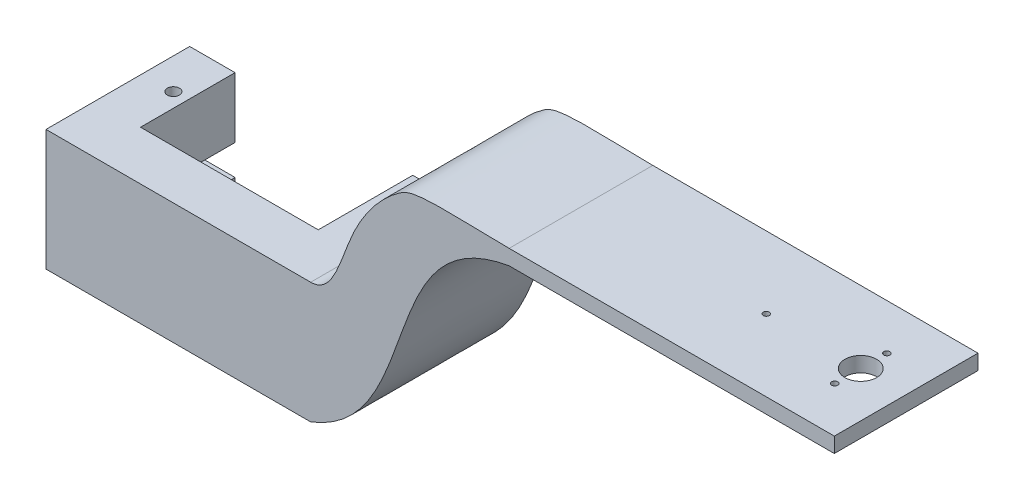
ISO-10303-21;
HEADER;
FILE_DESCRIPTION(('STEP AP214'),'2;1');
FILE_NAME('part.step','',(''),(''),'','','');
FILE_SCHEMA(('AUTOMOTIVE_DESIGN { 1 0 10303 214 1 1 1 1 }'));
ENDSEC;
DATA;
#1=APPLICATION_CONTEXT('core data for automotive mechanical design processes');
#2=APPLICATION_PROTOCOL_DEFINITION('international standard','automotive_design',2000,#1);
#3=PRODUCT_CONTEXT('',#1,'mechanical');
#4=PRODUCT('Part','Part','',(#3));
#5=PRODUCT_RELATED_PRODUCT_CATEGORY('part','',(#4));
#6=PRODUCT_DEFINITION_FORMATION('','',#4);
#7=PRODUCT_DEFINITION_CONTEXT('part definition',#1,'design');
#8=PRODUCT_DEFINITION('design','',#6,#7);
#9=PRODUCT_DEFINITION_SHAPE('','',#8);
#10=(LENGTH_UNIT() NAMED_UNIT(*) SI_UNIT(.MILLI.,.METRE.));
#11=(NAMED_UNIT(*) PLANE_ANGLE_UNIT() SI_UNIT($,.RADIAN.));
#12=(NAMED_UNIT(*) SI_UNIT($,.STERADIAN.) SOLID_ANGLE_UNIT());
#13=UNCERTAINTY_MEASURE_WITH_UNIT(LENGTH_MEASURE(1.E-05),#10,'distance_accuracy_value','');
#14=(GEOMETRIC_REPRESENTATION_CONTEXT(3) GLOBAL_UNCERTAINTY_ASSIGNED_CONTEXT((#13)) GLOBAL_UNIT_ASSIGNED_CONTEXT((#10,
#11,#12)) REPRESENTATION_CONTEXT('',''));
#15=CARTESIAN_POINT('',(0.,0.,0.));
#16=DIRECTION('',(0.,0.,1.));
#17=DIRECTION('',(1.,0.,0.));
#18=AXIS2_PLACEMENT_3D('',#15,#16,#17);
#19=CARTESIAN_POINT('',(-9.99999999999999,2.,-9.50000000000001));
#20=DIRECTION('',(0.,0.,1.));
#21=DIRECTION('',(1.,0.,0.));
#22=AXIS2_PLACEMENT_3D('',#19,#20,#21);
#23=PLANE('',#22);
#24=DIRECTION('',(1.,0.,0.));
#25=VECTOR('',#24,1.);
#26=CARTESIAN_POINT('',(-9.99999999999999,-6.,-9.50000000000001));
#27=LINE('',#26,#25);
#28=CARTESIAN_POINT('',(-45.,-6.,-9.5));
#29=VERTEX_POINT('',#28);
#30=CARTESIAN_POINT('',(-39.,-6.,-9.5));
#31=VERTEX_POINT('',#30);
#32=EDGE_CURVE('E333',#29,#31,#27,.T.);
#33=ORIENTED_EDGE('',*,*,#32,.F.);
#34=DIRECTION('',(0.,-1.,0.));
#35=VECTOR('',#34,1.);
#36=CARTESIAN_POINT('',(-45.,2.,-9.5));
#37=LINE('',#36,#35);
#38=CARTESIAN_POINT('',(-45.,2.,-9.5));
#39=VERTEX_POINT('',#38);
#40=EDGE_CURVE('E336',#39,#29,#37,.T.);
#41=ORIENTED_EDGE('',*,*,#40,.F.);
#42=DIRECTION('',(-1.,0.,0.));
#43=VECTOR('',#42,1.);
#44=CARTESIAN_POINT('',(-9.99999999999999,2.,-9.50000000000001));
#45=LINE('',#44,#43);
#46=CARTESIAN_POINT('',(-39.,2.,-9.5));
#47=VERTEX_POINT('',#46);
#48=EDGE_CURVE('E470',#47,#39,#45,.T.);
#49=ORIENTED_EDGE('',*,*,#48,.F.);
#50=DIRECTION('',(0.,1.,0.));
#51=VECTOR('',#50,1.);
#52=CARTESIAN_POINT('',(-39.,-14.,-9.5));
#53=LINE('',#52,#51);
#54=EDGE_CURVE('E338',#31,#47,#53,.T.);
#55=ORIENTED_EDGE('',*,*,#54,.F.);
#56=EDGE_LOOP('',(#33,#41,#49,#55));
#57=FACE_BOUND('',#56,.T.);
#58=ADVANCED_FACE('F41',(#57),#23,.F.);
#59=DIRECTION('',(-1.,0.,0.));
#60=VECTOR('',#59,1.);
#61=CARTESIAN_POINT('',(-9.99999999999999,-10.,-9.50000000000001));
#62=LINE('',#61,#60);
#63=CARTESIAN_POINT('',(-39.,-10.,-9.5));
#64=VERTEX_POINT('',#63);
#65=CARTESIAN_POINT('',(-45.,-10.,-9.5));
#66=VERTEX_POINT('',#65);
#67=EDGE_CURVE('E535',#64,#66,#62,.T.);
#68=ORIENTED_EDGE('',*,*,#67,.F.);
#69=CARTESIAN_POINT('',(-39.,-14.,-9.5));
#70=VERTEX_POINT('',#69);
#71=EDGE_CURVE('E498',#70,#64,#53,.T.);
#72=ORIENTED_EDGE('',*,*,#71,.F.);
#73=DIRECTION('',(1.,0.,0.));
#74=VECTOR('',#73,1.);
#75=CARTESIAN_POINT('',(-45.,-14.,-9.50000000000001));
#76=LINE('',#75,#74);
#77=CARTESIAN_POINT('',(-45.,-14.,-9.50000000000001));
#78=VERTEX_POINT('',#77);
#79=EDGE_CURVE('E452',#78,#70,#76,.T.);
#80=ORIENTED_EDGE('',*,*,#79,.F.);
#81=EDGE_CURVE('E352',#66,#78,#37,.T.);
#82=ORIENTED_EDGE('',*,*,#81,.F.);
#83=EDGE_LOOP('',(#68,#72,#80,#82));
#84=FACE_BOUND('',#83,.T.);
#85=ADVANCED_FACE('F300',(#84),#23,.F.);
#86=CARTESIAN_POINT('',(-45.,2.,9.5));
#87=DIRECTION('',(1.,0.,0.));
#88=DIRECTION('',(0.,0.,-1.));
#89=AXIS2_PLACEMENT_3D('',#86,#87,#88);
#90=PLANE('',#89);
#91=DIRECTION('',(0.,0.,-1.));
#92=VECTOR('',#91,1.);
#93=CARTESIAN_POINT('',(-45.,-6.,9.5));
#94=LINE('',#93,#92);
#95=CARTESIAN_POINT('',(-45.,-6.,1.27644844882707));
#96=VERTEX_POINT('',#95);
#97=EDGE_CURVE('E342',#96,#29,#94,.T.);
#98=ORIENTED_EDGE('',*,*,#97,.F.);
#99=DIRECTION('',(0.,1.,0.));
#100=VECTOR('',#99,1.);
#101=CARTESIAN_POINT('',(-45.,2.,1.27644844882707));
#102=LINE('',#101,#100);
#103=CARTESIAN_POINT('',(-45.,-10.,1.27644844882707));
#104=VERTEX_POINT('',#103);
#105=EDGE_CURVE('E519',#104,#96,#102,.T.);
#106=ORIENTED_EDGE('',*,*,#105,.F.);
#107=DIRECTION('',(0.,0.,1.));
#108=VECTOR('',#107,1.);
#109=CARTESIAN_POINT('',(-45.,-10.,9.5));
#110=LINE('',#109,#108);
#111=EDGE_CURVE('E532',#66,#104,#110,.T.);
#112=ORIENTED_EDGE('',*,*,#111,.F.);
#113=ORIENTED_EDGE('',*,*,#81,.T.);
#114=DIRECTION('',(0.,0.,-1.));
#115=VECTOR('',#114,1.);
#116=CARTESIAN_POINT('',(-45.,-14.,9.5));
#117=LINE('',#116,#115);
#118=CARTESIAN_POINT('',(-45.,-14.,9.5));
#119=VERTEX_POINT('',#118);
#120=EDGE_CURVE('E501',#119,#78,#117,.T.);
#121=ORIENTED_EDGE('',*,*,#120,.F.);
#122=DIRECTION('',(0.,-1.,0.));
#123=VECTOR('',#122,1.);
#124=CARTESIAN_POINT('',(-45.,2.,9.5));
#125=LINE('',#124,#123);
#126=CARTESIAN_POINT('',(-45.,2.,9.5));
#127=VERTEX_POINT('',#126);
#128=EDGE_CURVE('E351',#127,#119,#125,.T.);
#129=ORIENTED_EDGE('',*,*,#128,.F.);
#130=DIRECTION('',(0.,0.,1.));
#131=VECTOR('',#130,1.);
#132=CARTESIAN_POINT('',(-45.,2.,9.5));
#133=LINE('',#132,#131);
#134=EDGE_CURVE('E349',#39,#127,#133,.T.);
#135=ORIENTED_EDGE('',*,*,#134,.F.);
#136=ORIENTED_EDGE('',*,*,#40,.T.);
#137=EDGE_LOOP('',(#98,#106,#112,#113,#121,#129,#135,#136));
#138=FACE_BOUND('',#137,.T.);
#139=ADVANCED_FACE('F289',(#138),#90,.F.);
#140=CARTESIAN_POINT('',(-39.,-14.,3.));
#141=DIRECTION('',(-1.,0.,0.));
#142=DIRECTION('',(0.,0.,1.));
#143=AXIS2_PLACEMENT_3D('',#140,#141,#142);
#144=PLANE('',#143);
#145=DIRECTION('',(0.,0.,1.));
#146=VECTOR('',#145,1.);
#147=CARTESIAN_POINT('',(-39.,-6.,3.));
#148=LINE('',#147,#146);
#149=CARTESIAN_POINT('',(-39.,-6.,1.27644844882707));
#150=VERTEX_POINT('',#149);
#151=EDGE_CURVE('E343',#31,#150,#148,.T.);
#152=ORIENTED_EDGE('',*,*,#151,.F.);
#153=ORIENTED_EDGE('',*,*,#54,.T.);
#154=DIRECTION('',(0.,0.,1.));
#155=VECTOR('',#154,1.);
#156=CARTESIAN_POINT('',(-39.,2.,3.));
#157=LINE('',#156,#155);
#158=CARTESIAN_POINT('',(-39.,2.,3.));
#159=VERTEX_POINT('',#158);
#160=EDGE_CURVE('E494',#47,#159,#157,.T.);
#161=ORIENTED_EDGE('',*,*,#160,.T.);
#162=DIRECTION('',(0.,1.,0.));
#163=VECTOR('',#162,1.);
#164=CARTESIAN_POINT('',(-39.,-14.,3.));
#165=LINE('',#164,#163);
#166=CARTESIAN_POINT('',(-39.,-14.,3.));
#167=VERTEX_POINT('',#166);
#168=EDGE_CURVE('E505',#167,#159,#165,.T.);
#169=ORIENTED_EDGE('',*,*,#168,.F.);
#170=DIRECTION('',(0.,0.,1.));
#171=VECTOR('',#170,1.);
#172=CARTESIAN_POINT('',(-39.,-14.,3.));
#173=LINE('',#172,#171);
#174=EDGE_CURVE('E486',#70,#167,#173,.T.);
#175=ORIENTED_EDGE('',*,*,#174,.F.);
#176=ORIENTED_EDGE('',*,*,#71,.T.);
#177=DIRECTION('',(0.,0.,-1.));
#178=VECTOR('',#177,1.);
#179=CARTESIAN_POINT('',(-39.,-10.,3.));
#180=LINE('',#179,#178);
#181=CARTESIAN_POINT('',(-39.,-10.,1.27644844882707));
#182=VERTEX_POINT('',#181);
#183=EDGE_CURVE('E538',#182,#64,#180,.T.);
#184=ORIENTED_EDGE('',*,*,#183,.F.);
#185=DIRECTION('',(0.,-1.,0.));
#186=VECTOR('',#185,1.);
#187=CARTESIAN_POINT('',(-39.,-14.,1.27644844882707));
#188=LINE('',#187,#186);
#189=EDGE_CURVE('E521',#150,#182,#188,.T.);
#190=ORIENTED_EDGE('',*,*,#189,.F.);
#191=EDGE_LOOP('',(#152,#153,#161,#169,#175,#176,#184,#190));
#192=FACE_BOUND('',#191,.T.);
#193=ADVANCED_FACE('F285',(#192),#144,.F.);
#194=CARTESIAN_POINT('',(-9.99999999999999,2.,9.5));
#195=DIRECTION('',(0.,0.,-1.));
#196=DIRECTION('',(-1.,0.,0.));
#197=AXIS2_PLACEMENT_3D('',#194,#195,#196);
#198=PLANE('',#197);
#199=ORIENTED_EDGE('',*,*,#128,.T.);
#200=DIRECTION('',(-1.,0.,0.));
#201=VECTOR('',#200,1.);
#202=CARTESIAN_POINT('',(-45.,-14.,9.5));
#203=LINE('',#202,#201);
#204=CARTESIAN_POINT('',(-9.99999999999999,-14.,9.5));
#205=VERTEX_POINT('',#204);
#206=EDGE_CURVE('E451',#205,#119,#203,.T.);
#207=ORIENTED_EDGE('',*,*,#206,.F.);
#208=CARTESIAN_POINT('',(-9.99999999999999,-14.,9.5));
#209=CARTESIAN_POINT('',(5.21569135394911,-8.08288129869125,9.5));
#210=CARTESIAN_POINT('',(-1.57165890281514,13.9676971465737,9.5));
#211=CARTESIAN_POINT('',(16.2442553747671,17.,9.5));
#212=B_SPLINE_CURVE_WITH_KNOTS('',3,(#208,#209,#210,#211),.UNSPECIFIED.,.F.,.F.,(4,4),(0.,1.),.UNSPECIFIED.);
#213=CARTESIAN_POINT('',(16.2442553747671,17.,9.5));
#214=VERTEX_POINT('',#213);
#215=EDGE_CURVE('E169',#205,#214,#212,.T.);
#216=ORIENTED_EDGE('',*,*,#215,.T.);
#217=DIRECTION('',(-1.,0.,0.));
#218=VECTOR('',#217,1.);
#219=CARTESIAN_POINT('',(56.2442553747671,17.,9.5));
#220=LINE('',#219,#218);
#221=CARTESIAN_POINT('',(59.2442553747671,17.,9.5));
#222=VERTEX_POINT('',#221);
#223=EDGE_CURVE('E238',#222,#214,#220,.T.);
#224=ORIENTED_EDGE('',*,*,#223,.F.);
#225=DIRECTION('',(0.,-1.,0.));
#226=VECTOR('',#225,1.);
#227=CARTESIAN_POINT('',(59.2442553747671,19.,9.5));
#228=LINE('',#227,#226);
#229=CARTESIAN_POINT('',(59.2442553747671,19.,9.5));
#230=VERTEX_POINT('',#229);
#231=EDGE_CURVE('E180',#230,#222,#228,.T.);
#232=ORIENTED_EDGE('',*,*,#231,.F.);
#233=DIRECTION('',(-1.,0.,0.));
#234=VECTOR('',#233,1.);
#235=CARTESIAN_POINT('',(56.2442553747671,19.,9.5));
#236=LINE('',#235,#234);
#237=CARTESIAN_POINT('',(16.2442553747671,19.,9.5));
#238=VERTEX_POINT('',#237);
#239=EDGE_CURVE('E170',#230,#238,#236,.T.);
#240=ORIENTED_EDGE('',*,*,#239,.T.);
#241=CARTESIAN_POINT('',(16.2442553747671,19.,9.5));
#242=CARTESIAN_POINT('',(11.2126075886344,19.,9.5));
#243=CARTESIAN_POINT('',(4.06646906797156,19.553217376439,9.5));
#244=CARTESIAN_POINT('',(-0.106803103522299,16.9833287421813,9.5));
#245=CARTESIAN_POINT('',(-5.24229462163909,11.0378133686641,9.5));
#246=CARTESIAN_POINT('',(-6.97775803900934,1.99999999999998,9.5));
#247=CARTESIAN_POINT('',(-9.99999999999999,2.,9.5));
#248=B_SPLINE_CURVE_WITH_KNOTS('',3,(#241,#242,#243,#244,#245,#246,#247),.UNSPECIFIED.,.F.,.F.,
(4,1,1,1,4),(0.,0.246137696342118,0.311425048470264,0.652873521281456,1.),.UNSPECIFIED.);
#249=CARTESIAN_POINT('',(-9.99999999999999,2.,9.5));
#250=VERTEX_POINT('',#249);
#251=EDGE_CURVE('E250',#238,#250,#248,.T.);
#252=ORIENTED_EDGE('',*,*,#251,.T.);
#253=DIRECTION('',(1.,0.,0.));
#254=VECTOR('',#253,1.);
#255=CARTESIAN_POINT('',(-9.99999999999999,2.,9.5));
#256=LINE('',#255,#254);
#257=EDGE_CURVE('E464',#127,#250,#256,.T.);
#258=ORIENTED_EDGE('',*,*,#257,.F.);
#259=EDGE_LOOP('',(#199,#207,#216,#224,#232,#240,#252,#258));
#260=FACE_BOUND('',#259,.T.);
#261=ADVANCED_FACE('F288',(#260),#198,.F.);
#262=CARTESIAN_POINT('',(-15.5,-14.,-9.50000000000001));
#263=VERTEX_POINT('',#262);
#264=CARTESIAN_POINT('',(-9.99999999999999,-14.,-9.5));
#265=VERTEX_POINT('',#264);
#266=EDGE_CURVE('E458',#263,#265,#76,.T.);
#267=ORIENTED_EDGE('',*,*,#266,.F.);
#268=DIRECTION('',(0.,1.,0.));
#269=VECTOR('',#268,1.);
#270=CARTESIAN_POINT('',(-15.5,-14.,-9.50000000000001));
#271=LINE('',#270,#269);
#272=CARTESIAN_POINT('',(-15.5,2.,-9.50000000000001));
#273=VERTEX_POINT('',#272);
#274=EDGE_CURVE('E480',#263,#273,#271,.T.);
#275=ORIENTED_EDGE('',*,*,#274,.T.);
#276=CARTESIAN_POINT('',(-9.99999999999999,2.,-9.5));
#277=VERTEX_POINT('',#276);
#278=EDGE_CURVE('E358',#277,#273,#45,.T.);
#279=ORIENTED_EDGE('',*,*,#278,.F.);
#280=CARTESIAN_POINT('',(16.2442553747671,19.,-9.5));
#281=CARTESIAN_POINT('',(11.2126075886344,19.,-9.5));
#282=CARTESIAN_POINT('',(4.06646906797156,19.553217376439,-9.5));
#283=CARTESIAN_POINT('',(-0.106803103522299,16.9833287421813,-9.5));
#284=CARTESIAN_POINT('',(-5.24229462163909,11.0378133686641,-9.5));
#285=CARTESIAN_POINT('',(-6.97775803900934,1.99999999999998,-9.5));
#286=CARTESIAN_POINT('',(-9.99999999999999,2.,-9.5));
#287=B_SPLINE_CURVE_WITH_KNOTS('',3,(#280,#281,#282,#283,#284,#285,#286),.UNSPECIFIED.,.F.,.F.,
(4,1,1,1,4),(0.,0.246137696342118,0.311425048470264,0.652873521281456,1.),.UNSPECIFIED.);
#288=CARTESIAN_POINT('',(16.2442553747671,19.,-9.5));
#289=VERTEX_POINT('',#288);
#290=EDGE_CURVE('E165',#289,#277,#287,.T.);
#291=ORIENTED_EDGE('',*,*,#290,.F.);
#292=DIRECTION('',(-1.,0.,0.));
#293=VECTOR('',#292,1.);
#294=CARTESIAN_POINT('',(56.2442553747671,19.,-9.5));
#295=LINE('',#294,#293);
#296=CARTESIAN_POINT('',(59.2442553747671,19.,-9.5));
#297=VERTEX_POINT('',#296);
#298=EDGE_CURVE('E157',#297,#289,#295,.T.);
#299=ORIENTED_EDGE('',*,*,#298,.F.);
#300=DIRECTION('',(0.,1.,0.));
#301=VECTOR('',#300,1.);
#302=CARTESIAN_POINT('',(59.2442553747671,19.,-9.5));
#303=LINE('',#302,#301);
#304=CARTESIAN_POINT('',(59.2442553747671,17.,-9.5));
#305=VERTEX_POINT('',#304);
#306=EDGE_CURVE('E163',#305,#297,#303,.T.);
#307=ORIENTED_EDGE('',*,*,#306,.F.);
#308=DIRECTION('',(-1.,0.,0.));
#309=VECTOR('',#308,1.);
#310=CARTESIAN_POINT('',(56.2442553747671,17.,-9.5));
#311=LINE('',#310,#309);
#312=CARTESIAN_POINT('',(16.2442553747671,17.,-9.5));
#313=VERTEX_POINT('',#312);
#314=EDGE_CURVE('E235',#305,#313,#311,.T.);
#315=ORIENTED_EDGE('',*,*,#314,.T.);
#316=CARTESIAN_POINT('',(-9.99999999999999,-14.,-9.5));
#317=CARTESIAN_POINT('',(5.21569135394911,-8.08288129869125,-9.5));
#318=CARTESIAN_POINT('',(-1.57165890281514,13.9676971465737,-9.5));
#319=CARTESIAN_POINT('',(16.2442553747671,17.,-9.5));
#320=B_SPLINE_CURVE_WITH_KNOTS('',3,(#316,#317,#318,#319),.UNSPECIFIED.,.F.,.F.,(4,4),(0.,1.),.UNSPECIFIED.);
#321=EDGE_CURVE('E243',#265,#313,#320,.T.);
#322=ORIENTED_EDGE('',*,*,#321,.F.);
#323=EDGE_LOOP('',(#267,#275,#279,#291,#299,#307,#315,#322));
#324=FACE_BOUND('',#323,.T.);
#325=ADVANCED_FACE('F160',(#324),#23,.F.);
#326=CARTESIAN_POINT('',(0.,2.,0.));
#327=DIRECTION('',(0.,1.,0.));
#328=DIRECTION('',(0.,0.,1.));
#329=AXIS2_PLACEMENT_3D('',#326,#327,#328);
#330=PLANE('',#329);
#331=CARTESIAN_POINT('',(-40.9,2.,-3.25));
#332=DIRECTION('',(0.,1.,0.));
#333=DIRECTION('',(0.,0.,1.));
#334=AXIS2_PLACEMENT_3D('',#331,#332,#333);
#335=CIRCLE('',#334,0.800000000000003);
#336=CARTESIAN_POINT('',(-40.9,2.,-2.45));
#337=VERTEX_POINT('',#336);
#338=EDGE_CURVE('E191',#337,#337,#335,.T.);
#339=ORIENTED_EDGE('',*,*,#338,.F.);
#340=EDGE_LOOP('',(#339));
#341=FACE_BOUND('',#340,.T.);
#342=CARTESIAN_POINT('',(-13.6,2.,-3.25));
#343=DIRECTION('',(0.,1.,0.));
#344=DIRECTION('',(0.,0.,1.));
#345=AXIS2_PLACEMENT_3D('',#342,#343,#344);
#346=CIRCLE('',#345,0.800000000000001);
#347=CARTESIAN_POINT('',(-13.6,2.,-2.45));
#348=VERTEX_POINT('',#347);
#349=EDGE_CURVE('E194',#348,#348,#346,.T.);
#350=ORIENTED_EDGE('',*,*,#349,.F.);
#351=EDGE_LOOP('',(#350));
#352=FACE_BOUND('',#351,.T.);
#353=ORIENTED_EDGE('',*,*,#160,.F.);
#354=ORIENTED_EDGE('',*,*,#48,.T.);
#355=ORIENTED_EDGE('',*,*,#134,.T.);
#356=ORIENTED_EDGE('',*,*,#257,.T.);
#357=DIRECTION('',(0.,0.,-1.));
#358=VECTOR('',#357,1.);
#359=CARTESIAN_POINT('',(-9.99999999999999,2.,9.5));
#360=LINE('',#359,#358);
#361=EDGE_CURVE('E467',#250,#277,#360,.T.);
#362=ORIENTED_EDGE('',*,*,#361,.T.);
#363=ORIENTED_EDGE('',*,*,#278,.T.);
#364=DIRECTION('',(0.,0.,-1.));
#365=VECTOR('',#364,1.);
#366=CARTESIAN_POINT('',(-15.5,2.,3.));
#367=LINE('',#366,#365);
#368=CARTESIAN_POINT('',(-15.5,2.,3.));
#369=VERTEX_POINT('',#368);
#370=EDGE_CURVE('E479',#369,#273,#367,.T.);
#371=ORIENTED_EDGE('',*,*,#370,.F.);
#372=DIRECTION('',(1.,0.,0.));
#373=VECTOR('',#372,1.);
#374=CARTESIAN_POINT('',(-15.5,2.,3.));
#375=LINE('',#374,#373);
#376=EDGE_CURVE('E487',#159,#369,#375,.T.);
#377=ORIENTED_EDGE('',*,*,#376,.F.);
#378=EDGE_LOOP('',(#353,#354,#355,#356,#362,#363,#371,#377));
#379=FACE_BOUND('',#378,.T.);
#380=ADVANCED_FACE('F293',(#341,#352,#379),#330,.T.);
#381=CARTESIAN_POINT('',(0.,-14.,0.));
#382=DIRECTION('',(0.,-1.,0.));
#383=DIRECTION('',(0.,0.,-1.));
#384=AXIS2_PLACEMENT_3D('',#381,#382,#383);
#385=PLANE('',#384);
#386=CARTESIAN_POINT('',(-42.4266966629172,-14.,7.29208848893883));
#387=DIRECTION('',(0.,-1.,0.));
#388=DIRECTION('',(0.,0.,1.));
#389=AXIS2_PLACEMENT_3D('',#386,#387,#388);
#390=CIRCLE('',#389,0.713910761154859);
#391=CARTESIAN_POINT('',(-42.4266966629172,-14.,8.00599925009369));
#392=VERTEX_POINT('',#391);
#393=EDGE_CURVE('E218',#392,#392,#390,.T.);
#394=ORIENTED_EDGE('',*,*,#393,.F.);
#395=EDGE_LOOP('',(#394));
#396=FACE_BOUND('',#395,.T.);
#397=CARTESIAN_POINT('',(-12.8503937007874,-14.,7.29208848893883));
#398=DIRECTION('',(0.,-1.,0.));
#399=DIRECTION('',(0.,0.,1.));
#400=AXIS2_PLACEMENT_3D('',#397,#398,#399);
#401=CIRCLE('',#400,0.713910761154859);
#402=CARTESIAN_POINT('',(-12.8503937007874,-14.,8.00599925009369));
#403=VERTEX_POINT('',#402);
#404=EDGE_CURVE('E222',#403,#403,#401,.T.);
#405=ORIENTED_EDGE('',*,*,#404,.F.);
#406=EDGE_LOOP('',(#405));
#407=FACE_BOUND('',#406,.T.);
#408=CARTESIAN_POINT('',(-12.8503937007874,-14.,-7.29208848893883));
#409=DIRECTION('',(0.,-1.,0.));
#410=DIRECTION('',(0.,0.,-1.));
#411=AXIS2_PLACEMENT_3D('',#408,#409,#410);
#412=CIRCLE('',#411,0.713910761154859);
#413=CARTESIAN_POINT('',(-12.8503937007874,-14.,-8.00599925009369));
#414=VERTEX_POINT('',#413);
#415=EDGE_CURVE('E227',#414,#414,#412,.T.);
#416=ORIENTED_EDGE('',*,*,#415,.F.);
#417=EDGE_LOOP('',(#416));
#418=FACE_BOUND('',#417,.T.);
#419=CARTESIAN_POINT('',(-42.4266966629172,-14.,-7.29208848893883));
#420=DIRECTION('',(0.,-1.,0.));
#421=DIRECTION('',(0.,0.,-1.));
#422=AXIS2_PLACEMENT_3D('',#419,#420,#421);
#423=CIRCLE('',#422,0.713910761154859);
#424=CARTESIAN_POINT('',(-42.4266966629172,-14.,-8.00599925009369));
#425=VERTEX_POINT('',#424);
#426=EDGE_CURVE('E231',#425,#425,#423,.T.);
#427=ORIENTED_EDGE('',*,*,#426,.F.);
#428=EDGE_LOOP('',(#427));
#429=FACE_BOUND('',#428,.T.);
#430=ORIENTED_EDGE('',*,*,#174,.T.);
#431=DIRECTION('',(1.,0.,0.));
#432=VECTOR('',#431,1.);
#433=CARTESIAN_POINT('',(-15.5,-14.,3.));
#434=LINE('',#433,#432);
#435=CARTESIAN_POINT('',(-15.5,-14.,3.));
#436=VERTEX_POINT('',#435);
#437=EDGE_CURVE('E492',#167,#436,#434,.T.);
#438=ORIENTED_EDGE('',*,*,#437,.T.);
#439=DIRECTION('',(0.,0.,-1.));
#440=VECTOR('',#439,1.);
#441=CARTESIAN_POINT('',(-15.5,-14.,3.));
#442=LINE('',#441,#440);
#443=EDGE_CURVE('E67',#436,#263,#442,.T.);
#444=ORIENTED_EDGE('',*,*,#443,.T.);
#445=ORIENTED_EDGE('',*,*,#266,.T.);
#446=DIRECTION('',(0.,0.,1.));
#447=VECTOR('',#446,1.);
#448=CARTESIAN_POINT('',(-9.99999999999999,-14.,9.5));
#449=LINE('',#448,#447);
#450=EDGE_CURVE('E446',#265,#205,#449,.T.);
#451=ORIENTED_EDGE('',*,*,#450,.T.);
#452=ORIENTED_EDGE('',*,*,#206,.T.);
#453=ORIENTED_EDGE('',*,*,#120,.T.);
#454=ORIENTED_EDGE('',*,*,#79,.T.);
#455=EDGE_LOOP('',(#430,#438,#444,#445,#451,#452,#453,#454));
#456=FACE_BOUND('',#455,.T.);
#457=ADVANCED_FACE('F281',(#396,#407,#418,#429,#456),#385,.T.);
#458=CARTESIAN_POINT('',(-15.5,-14.,3.));
#459=DIRECTION('',(1.,0.,0.));
#460=DIRECTION('',(0.,0.,-1.));
#461=AXIS2_PLACEMENT_3D('',#458,#459,#460);
#462=PLANE('',#461);
#463=ORIENTED_EDGE('',*,*,#370,.T.);
#464=ORIENTED_EDGE('',*,*,#274,.F.);
#465=ORIENTED_EDGE('',*,*,#443,.F.);
#466=DIRECTION('',(0.,1.,0.));
#467=VECTOR('',#466,1.);
#468=CARTESIAN_POINT('',(-15.5,-14.,3.));
#469=LINE('',#468,#467);
#470=EDGE_CURVE('E482',#436,#369,#469,.T.);
#471=ORIENTED_EDGE('',*,*,#470,.T.);
#472=EDGE_LOOP('',(#463,#464,#465,#471));
#473=FACE_BOUND('',#472,.T.);
#474=ADVANCED_FACE('F278',(#473),#462,.F.);
#475=CARTESIAN_POINT('',(-15.5,-14.,3.));
#476=DIRECTION('',(0.,0.,1.));
#477=DIRECTION('',(1.,0.,0.));
#478=AXIS2_PLACEMENT_3D('',#475,#476,#477);
#479=PLANE('',#478);
#480=ORIENTED_EDGE('',*,*,#376,.T.);
#481=ORIENTED_EDGE('',*,*,#470,.F.);
#482=ORIENTED_EDGE('',*,*,#437,.F.);
#483=ORIENTED_EDGE('',*,*,#168,.T.);
#484=EDGE_LOOP('',(#480,#481,#482,#483));
#485=FACE_BOUND('',#484,.T.);
#486=ADVANCED_FACE('F276',(#485),#479,.F.);
#487=CARTESIAN_POINT('',(-50.5,-6.,1.27644844882707));
#488=DIRECTION('',(0.,0.,-1.));
#489=DIRECTION('',(-1.,0.,0.));
#490=AXIS2_PLACEMENT_3D('',#487,#488,#489);
#491=PLANE('',#490);
#492=ORIENTED_EDGE('',*,*,#105,.T.);
#493=DIRECTION('',(1.,0.,0.));
#494=VECTOR('',#493,1.);
#495=CARTESIAN_POINT('',(-50.5,-6.,1.27644844882707));
#496=LINE('',#495,#494);
#497=EDGE_CURVE('E541',#96,#150,#496,.T.);
#498=ORIENTED_EDGE('',*,*,#497,.T.);
#499=ORIENTED_EDGE('',*,*,#189,.T.);
#500=DIRECTION('',(1.,0.,0.));
#501=VECTOR('',#500,1.);
#502=CARTESIAN_POINT('',(-50.5,-10.,1.27644844882707));
#503=LINE('',#502,#501);
#504=EDGE_CURVE('E59',#104,#182,#503,.T.);
#505=ORIENTED_EDGE('',*,*,#504,.F.);
#506=EDGE_LOOP('',(#492,#498,#499,#505));
#507=FACE_BOUND('',#506,.T.);
#508=ADVANCED_FACE('F272',(#507),#491,.T.);
#509=CARTESIAN_POINT('',(-50.5,-6.,-10.7235515511729));
#510=DIRECTION('',(0.,-1.,0.));
#511=DIRECTION('',(0.,0.,-1.));
#512=AXIS2_PLACEMENT_3D('',#509,#510,#511);
#513=PLANE('',#512);
#514=CARTESIAN_POINT('',(-40.9,-6.,-3.25));
#515=DIRECTION('',(0.,1.,0.));
#516=DIRECTION('',(0.,0.,1.));
#517=AXIS2_PLACEMENT_3D('',#514,#515,#516);
#518=CIRCLE('',#517,0.800000000000003);
#519=CARTESIAN_POINT('',(-40.9,-6.,-2.45));
#520=VERTEX_POINT('',#519);
#521=EDGE_CURVE('E187',#520,#520,#518,.T.);
#522=ORIENTED_EDGE('',*,*,#521,.T.);
#523=EDGE_LOOP('',(#522));
#524=FACE_BOUND('',#523,.T.);
#525=ORIENTED_EDGE('',*,*,#97,.T.);
#526=ORIENTED_EDGE('',*,*,#32,.T.);
#527=ORIENTED_EDGE('',*,*,#151,.T.);
#528=ORIENTED_EDGE('',*,*,#497,.F.);
#529=EDGE_LOOP('',(#525,#526,#527,#528));
#530=FACE_BOUND('',#529,.T.);
#531=ADVANCED_FACE('F269',(#524,#530),#513,.T.);
#532=CARTESIAN_POINT('',(-50.5,-10.,-10.7235515511729));
#533=DIRECTION('',(0.,1.,0.));
#534=DIRECTION('',(0.,0.,1.));
#535=AXIS2_PLACEMENT_3D('',#532,#533,#534);
#536=PLANE('',#535);
#537=ORIENTED_EDGE('',*,*,#111,.T.);
#538=ORIENTED_EDGE('',*,*,#504,.T.);
#539=ORIENTED_EDGE('',*,*,#183,.T.);
#540=ORIENTED_EDGE('',*,*,#67,.T.);
#541=EDGE_LOOP('',(#537,#538,#539,#540));
#542=FACE_BOUND('',#541,.T.);
#543=ADVANCED_FACE('F264',(#542),#536,.T.);
#544=DIRECTION('',(0.,0.,1.));
#545=VECTOR('',#544,1.);
#546=SURFACE_OF_LINEAR_EXTRUSION('',#320,#545);
#547=ORIENTED_EDGE('',*,*,#215,.F.);
#548=ORIENTED_EDGE('',*,*,#450,.F.);
#549=ORIENTED_EDGE('',*,*,#321,.T.);
#550=DIRECTION('',(0.,0.,1.));
#551=VECTOR('',#550,1.);
#552=CARTESIAN_POINT('',(16.2442553747671,17.,-9.5));
#553=LINE('',#552,#551);
#554=EDGE_CURVE('E438',#313,#214,#553,.T.);
#555=ORIENTED_EDGE('',*,*,#554,.T.);
#556=EDGE_LOOP('',(#547,#548,#549,#555));
#557=FACE_BOUND('',#556,.T.);
#558=ADVANCED_FACE('F259',(#557),#546,.T.);
#559=DIRECTION('',(0.,0.,1.));
#560=VECTOR('',#559,1.);
#561=SURFACE_OF_LINEAR_EXTRUSION('',#287,#560);
#562=ORIENTED_EDGE('',*,*,#251,.F.);
#563=DIRECTION('',(0.,0.,1.));
#564=VECTOR('',#563,1.);
#565=CARTESIAN_POINT('',(16.2442553747671,19.,-9.5));
#566=LINE('',#565,#564);
#567=EDGE_CURVE('E441',#289,#238,#566,.T.);
#568=ORIENTED_EDGE('',*,*,#567,.F.);
#569=ORIENTED_EDGE('',*,*,#290,.T.);
#570=ORIENTED_EDGE('',*,*,#361,.F.);
#571=EDGE_LOOP('',(#562,#568,#569,#570));
#572=FACE_BOUND('',#571,.T.);
#573=ADVANCED_FACE('F263',(#572),#561,.T.);
#574=CARTESIAN_POINT('',(56.2442553747671,19.,-9.5));
#575=DIRECTION('',(0.,-1.,0.));
#576=DIRECTION('',(0.,0.,-1.));
#577=AXIS2_PLACEMENT_3D('',#574,#575,#576);
#578=PLANE('',#577);
#579=CARTESIAN_POINT('',(53.2442553747671,19.,0.));
#580=DIRECTION('',(0.,1.,0.));
#581=DIRECTION('',(0.,0.,1.));
#582=AXIS2_PLACEMENT_3D('',#579,#580,#581);
#583=CIRCLE('',#582,2.1);
#584=CARTESIAN_POINT('',(53.2442553747671,19.,2.1));
#585=VERTEX_POINT('',#584);
#586=EDGE_CURVE('E201',#585,#585,#583,.T.);
#587=ORIENTED_EDGE('',*,*,#586,.F.);
#588=EDGE_LOOP('',(#587));
#589=FACE_BOUND('',#588,.T.);
#590=CARTESIAN_POINT('',(40.7442553747671,19.,0.));
#591=DIRECTION('',(0.,1.,0.));
#592=DIRECTION('',(0.,0.,1.));
#593=AXIS2_PLACEMENT_3D('',#590,#591,#592);
#594=CIRCLE('',#593,0.399999999999998);
#595=CARTESIAN_POINT('',(40.7442553747671,19.,0.400000000000001));
#596=VERTEX_POINT('',#595);
#597=EDGE_CURVE('E210',#596,#596,#594,.T.);
#598=ORIENTED_EDGE('',*,*,#597,.F.);
#599=EDGE_LOOP('',(#598));
#600=FACE_BOUND('',#599,.T.);
#601=CARTESIAN_POINT('',(53.2442553747671,19.,3.45));
#602=DIRECTION('',(0.,1.,0.));
#603=DIRECTION('',(0.,0.,-1.));
#604=AXIS2_PLACEMENT_3D('',#601,#602,#603);
#605=CIRCLE('',#604,0.399999999999998);
#606=CARTESIAN_POINT('',(53.2442553747671,19.,3.05000000000001));
#607=VERTEX_POINT('',#606);
#608=EDGE_CURVE('E205',#607,#607,#605,.T.);
#609=ORIENTED_EDGE('',*,*,#608,.F.);
#610=EDGE_LOOP('',(#609));
#611=FACE_BOUND('',#610,.T.);
#612=CARTESIAN_POINT('',(53.2442553747671,19.,-3.45));
#613=DIRECTION('',(0.,1.,0.));
#614=DIRECTION('',(0.,0.,1.));
#615=AXIS2_PLACEMENT_3D('',#612,#613,#614);
#616=CIRCLE('',#615,0.399999999999998);
#617=CARTESIAN_POINT('',(53.2442553747671,19.,-3.05));
#618=VERTEX_POINT('',#617);
#619=EDGE_CURVE('E209',#618,#618,#616,.T.);
#620=ORIENTED_EDGE('',*,*,#619,.F.);
#621=EDGE_LOOP('',(#620));
#622=FACE_BOUND('',#621,.T.);
#623=ORIENTED_EDGE('',*,*,#567,.T.);
#624=ORIENTED_EDGE('',*,*,#239,.F.);
#625=DIRECTION('',(0.,0.,1.));
#626=VECTOR('',#625,1.);
#627=CARTESIAN_POINT('',(59.2442553747671,19.,-9.5));
#628=LINE('',#627,#626);
#629=EDGE_CURVE('E173',#297,#230,#628,.T.);
#630=ORIENTED_EDGE('',*,*,#629,.F.);
#631=ORIENTED_EDGE('',*,*,#298,.T.);
#632=EDGE_LOOP('',(#623,#624,#630,#631));
#633=FACE_BOUND('',#632,.T.);
#634=ADVANCED_FACE('F174',(#589,#600,#611,#622,#633),#578,.F.);
#635=CARTESIAN_POINT('',(56.2442553747671,17.,-9.5));
#636=DIRECTION('',(0.,1.,0.));
#637=DIRECTION('',(0.,0.,1.));
#638=AXIS2_PLACEMENT_3D('',#635,#636,#637);
#639=PLANE('',#638);
#640=CARTESIAN_POINT('',(53.2442553747671,17.,0.));
#641=DIRECTION('',(0.,1.,0.));
#642=DIRECTION('',(0.,0.,1.));
#643=AXIS2_PLACEMENT_3D('',#640,#641,#642);
#644=CIRCLE('',#643,2.1);
#645=CARTESIAN_POINT('',(53.2442553747671,17.,2.1));
#646=VERTEX_POINT('',#645);
#647=EDGE_CURVE('E45',#646,#646,#644,.T.);
#648=ORIENTED_EDGE('',*,*,#647,.T.);
#649=EDGE_LOOP('',(#648));
#650=FACE_BOUND('',#649,.T.);
#651=CARTESIAN_POINT('',(40.7442553747671,17.,0.));
#652=DIRECTION('',(0.,1.,0.));
#653=DIRECTION('',(0.,0.,1.));
#654=AXIS2_PLACEMENT_3D('',#651,#652,#653);
#655=CIRCLE('',#654,0.399999999999998);
#656=CARTESIAN_POINT('',(40.7442553747671,17.,0.400000000000001));
#657=VERTEX_POINT('',#656);
#658=EDGE_CURVE('E223',#657,#657,#655,.T.);
#659=ORIENTED_EDGE('',*,*,#658,.T.);
#660=EDGE_LOOP('',(#659));
#661=FACE_BOUND('',#660,.T.);
#662=CARTESIAN_POINT('',(53.2442553747671,17.,3.45));
#663=DIRECTION('',(0.,1.,0.));
#664=DIRECTION('',(0.,0.,1.));
#665=AXIS2_PLACEMENT_3D('',#662,#663,#664);
#666=CIRCLE('',#665,0.399999999999998);
#667=CARTESIAN_POINT('',(53.2442553747671,17.,3.85));
#668=VERTEX_POINT('',#667);
#669=EDGE_CURVE('E375',#668,#668,#666,.T.);
#670=ORIENTED_EDGE('',*,*,#669,.T.);
#671=EDGE_LOOP('',(#670));
#672=FACE_BOUND('',#671,.T.);
#673=CARTESIAN_POINT('',(53.2442553747671,17.,-3.45));
#674=DIRECTION('',(0.,1.,0.));
#675=DIRECTION('',(0.,0.,1.));
#676=AXIS2_PLACEMENT_3D('',#673,#674,#675);
#677=CIRCLE('',#676,0.399999999999998);
#678=CARTESIAN_POINT('',(53.2442553747671,17.,-3.05));
#679=VERTEX_POINT('',#678);
#680=EDGE_CURVE('E217',#679,#679,#677,.T.);
#681=ORIENTED_EDGE('',*,*,#680,.T.);
#682=EDGE_LOOP('',(#681));
#683=FACE_BOUND('',#682,.T.);
#684=ORIENTED_EDGE('',*,*,#554,.F.);
#685=ORIENTED_EDGE('',*,*,#314,.F.);
#686=DIRECTION('',(0.,0.,-1.));
#687=VECTOR('',#686,1.);
#688=CARTESIAN_POINT('',(59.2442553747671,17.,-9.5));
#689=LINE('',#688,#687);
#690=EDGE_CURVE('E185',#222,#305,#689,.T.);
#691=ORIENTED_EDGE('',*,*,#690,.F.);
#692=ORIENTED_EDGE('',*,*,#223,.T.);
#693=EDGE_LOOP('',(#684,#685,#691,#692));
#694=FACE_BOUND('',#693,.T.);
#695=ADVANCED_FACE('F382',(#650,#661,#672,#683,#694),#639,.F.);
#696=CARTESIAN_POINT('',(-42.4266966629172,-14.5,-7.29208848893883));
#697=DIRECTION('',(0.,-1.,0.));
#698=DIRECTION('',(0.,0.,-1.));
#699=AXIS2_PLACEMENT_3D('',#696,#697,#698);
#700=PLANE('',#699);
#701=CARTESIAN_POINT('',(-42.4266966629172,-14.5,-7.29208848893883));
#702=DIRECTION('',(0.,-1.,0.));
#703=DIRECTION('',(0.,0.,-1.));
#704=AXIS2_PLACEMENT_3D('',#701,#702,#703);
#705=CIRCLE('',#704,0.213910761154859);
#706=CARTESIAN_POINT('',(-42.4266966629172,-14.5,-7.50599925009369));
#707=VERTEX_POINT('',#706);
#708=EDGE_CURVE('E51',#707,#707,#705,.T.);
#709=ORIENTED_EDGE('',*,*,#708,.T.);
#710=EDGE_LOOP('',(#709));
#711=FACE_BOUND('',#710,.T.);
#712=ADVANCED_FACE('F413',(#711),#700,.T.);
#713=CARTESIAN_POINT('',(-12.8503937007874,-14.5,-7.29208848893883));
#714=DIRECTION('',(0.,-1.,0.));
#715=DIRECTION('',(0.,0.,-1.));
#716=AXIS2_PLACEMENT_3D('',#713,#714,#715);
#717=PLANE('',#716);
#718=CARTESIAN_POINT('',(-12.8503937007874,-14.5,-7.29208848893883));
#719=DIRECTION('',(0.,-1.,0.));
#720=DIRECTION('',(0.,0.,-1.));
#721=AXIS2_PLACEMENT_3D('',#718,#719,#720);
#722=CIRCLE('',#721,0.213910761154859);
#723=CARTESIAN_POINT('',(-12.8503937007874,-14.5,-7.50599925009369));
#724=VERTEX_POINT('',#723);
#725=EDGE_CURVE('E356',#724,#724,#722,.T.);
#726=ORIENTED_EDGE('',*,*,#725,.T.);
#727=EDGE_LOOP('',(#726));
#728=FACE_BOUND('',#727,.T.);
#729=ADVANCED_FACE('F409',(#728),#717,.T.);
#730=CARTESIAN_POINT('',(-12.8503937007874,-14.5,7.29208848893883));
#731=DIRECTION('',(0.,1.,0.));
#732=DIRECTION('',(0.,0.,1.));
#733=AXIS2_PLACEMENT_3D('',#730,#731,#732);
#734=PLANE('',#733);
#735=CARTESIAN_POINT('',(-12.8503937007874,-14.5,7.29208848893883));
#736=DIRECTION('',(0.,1.,0.));
#737=DIRECTION('',(0.,0.,1.));
#738=AXIS2_PLACEMENT_3D('',#735,#736,#737);
#739=CIRCLE('',#738,0.213910761154859);
#740=CARTESIAN_POINT('',(-12.8503937007874,-14.5,7.50599925009369));
#741=VERTEX_POINT('',#740);
#742=EDGE_CURVE('E365',#741,#741,#739,.F.);
#743=ORIENTED_EDGE('',*,*,#742,.T.);
#744=EDGE_LOOP('',(#743));
#745=FACE_BOUND('',#744,.T.);
#746=ADVANCED_FACE('F405',(#745),#734,.F.);
#747=CARTESIAN_POINT('',(-42.4266966629172,-14.5,7.29208848893883));
#748=DIRECTION('',(0.,1.,0.));
#749=DIRECTION('',(0.,0.,1.));
#750=AXIS2_PLACEMENT_3D('',#747,#748,#749);
#751=PLANE('',#750);
#752=CARTESIAN_POINT('',(-42.4266966629172,-14.5,7.29208848893883));
#753=DIRECTION('',(0.,1.,0.));
#754=DIRECTION('',(0.,0.,1.));
#755=AXIS2_PLACEMENT_3D('',#752,#753,#754);
#756=CIRCLE('',#755,0.213910761154859);
#757=CARTESIAN_POINT('',(-42.4266966629172,-14.5,7.50599925009369));
#758=VERTEX_POINT('',#757);
#759=EDGE_CURVE('E11',#758,#758,#756,.F.);
#760=ORIENTED_EDGE('',*,*,#759,.T.);
#761=EDGE_LOOP('',(#760));
#762=FACE_BOUND('',#761,.T.);
#763=ADVANCED_FACE('F311',(#762),#751,.F.);
#764=CARTESIAN_POINT('',(-12.8503937007874,-14.,-7.29208848893883));
#765=DIRECTION('',(0.,-1.,0.));
#766=DIRECTION('',(0.,0.,-1.));
#767=AXIS2_PLACEMENT_3D('',#764,#765,#766);
#768=DEGENERATE_TOROIDAL_SURFACE('',#767,0.213910761154859,0.5,.T.);
#769=ORIENTED_EDGE('',*,*,#415,.T.);
#770=EDGE_LOOP('',(#769));
#771=FACE_BOUND('',#770,.T.);
#772=ORIENTED_EDGE('',*,*,#725,.F.);
#773=EDGE_LOOP('',(#772));
#774=FACE_BOUND('',#773,.T.);
#775=ADVANCED_FACE('F307',(#771,#774),#768,.T.);
#776=CARTESIAN_POINT('',(-12.8503937007874,-14.,7.29208848893883));
#777=DIRECTION('',(0.,1.,0.));
#778=DIRECTION('',(0.,0.,1.));
#779=AXIS2_PLACEMENT_3D('',#776,#777,#778);
#780=DEGENERATE_TOROIDAL_SURFACE('',#779,0.213910761154859,0.5,.T.);
#781=ORIENTED_EDGE('',*,*,#404,.T.);
#782=EDGE_LOOP('',(#781));
#783=FACE_BOUND('',#782,.T.);
#784=ORIENTED_EDGE('',*,*,#742,.F.);
#785=EDGE_LOOP('',(#784));
#786=FACE_BOUND('',#785,.T.);
#787=ADVANCED_FACE('F310',(#783,#786),#780,.T.);
#788=CARTESIAN_POINT('',(-42.4266966629172,-14.,-7.29208848893883));
#789=DIRECTION('',(0.,-1.,0.));
#790=DIRECTION('',(0.,0.,-1.));
#791=AXIS2_PLACEMENT_3D('',#788,#789,#790);
#792=DEGENERATE_TOROIDAL_SURFACE('',#791,0.213910761154859,0.5,.T.);
#793=ORIENTED_EDGE('',*,*,#426,.T.);
#794=EDGE_LOOP('',(#793));
#795=FACE_BOUND('',#794,.T.);
#796=ORIENTED_EDGE('',*,*,#708,.F.);
#797=EDGE_LOOP('',(#796));
#798=FACE_BOUND('',#797,.T.);
#799=ADVANCED_FACE('F314',(#795,#798),#792,.T.);
#800=CARTESIAN_POINT('',(-42.4266966629172,-14.,7.29208848893883));
#801=DIRECTION('',(0.,1.,0.));
#802=DIRECTION('',(0.,0.,1.));
#803=AXIS2_PLACEMENT_3D('',#800,#801,#802);
#804=DEGENERATE_TOROIDAL_SURFACE('',#803,0.213910761154859,0.5,.T.);
#805=ORIENTED_EDGE('',*,*,#393,.T.);
#806=EDGE_LOOP('',(#805));
#807=FACE_BOUND('',#806,.T.);
#808=ORIENTED_EDGE('',*,*,#759,.F.);
#809=EDGE_LOOP('',(#808));
#810=FACE_BOUND('',#809,.T.);
#811=ADVANCED_FACE('F43',(#807,#810),#804,.T.);
#812=CARTESIAN_POINT('',(53.2442553747671,8.5,-3.45));
#813=DIRECTION('',(0.,1.,0.));
#814=DIRECTION('',(0.,0.,1.));
#815=AXIS2_PLACEMENT_3D('',#812,#813,#814);
#816=CYLINDRICAL_SURFACE('',#815,0.399999999999998);
#817=ORIENTED_EDGE('',*,*,#619,.T.);
#818=EDGE_LOOP('',(#817));
#819=FACE_BOUND('',#818,.T.);
#820=ORIENTED_EDGE('',*,*,#680,.F.);
#821=EDGE_LOOP('',(#820));
#822=FACE_BOUND('',#821,.T.);
#823=ADVANCED_FACE('F321',(#819,#822),#816,.F.);
#824=CARTESIAN_POINT('',(53.2442553747671,8.5,3.45));
#825=DIRECTION('',(0.,1.,0.));
#826=DIRECTION('',(0.,0.,1.));
#827=AXIS2_PLACEMENT_3D('',#824,#825,#826);
#828=CYLINDRICAL_SURFACE('',#827,0.399999999999998);
#829=ORIENTED_EDGE('',*,*,#608,.T.);
#830=EDGE_LOOP('',(#829));
#831=FACE_BOUND('',#830,.T.);
#832=ORIENTED_EDGE('',*,*,#669,.F.);
#833=EDGE_LOOP('',(#832));
#834=FACE_BOUND('',#833,.T.);
#835=ADVANCED_FACE('F388',(#831,#834),#828,.F.);
#836=CARTESIAN_POINT('',(40.7442553747671,8.5,0.));
#837=DIRECTION('',(0.,1.,0.));
#838=DIRECTION('',(0.,0.,1.));
#839=AXIS2_PLACEMENT_3D('',#836,#837,#838);
#840=CYLINDRICAL_SURFACE('',#839,0.399999999999998);
#841=ORIENTED_EDGE('',*,*,#597,.T.);
#842=EDGE_LOOP('',(#841));
#843=FACE_BOUND('',#842,.T.);
#844=ORIENTED_EDGE('',*,*,#658,.F.);
#845=EDGE_LOOP('',(#844));
#846=FACE_BOUND('',#845,.T.);
#847=ADVANCED_FACE('F385',(#843,#846),#840,.F.);
#848=CARTESIAN_POINT('',(53.2442553747671,8.5,0.));
#849=DIRECTION('',(0.,1.,0.));
#850=DIRECTION('',(0.,0.,1.));
#851=AXIS2_PLACEMENT_3D('',#848,#849,#850);
#852=CYLINDRICAL_SURFACE('',#851,2.1);
#853=ORIENTED_EDGE('',*,*,#586,.T.);
#854=EDGE_LOOP('',(#853));
#855=FACE_BOUND('',#854,.T.);
#856=ORIENTED_EDGE('',*,*,#647,.F.);
#857=EDGE_LOOP('',(#856));
#858=FACE_BOUND('',#857,.T.);
#859=ADVANCED_FACE('F387',(#855,#858),#852,.F.);
#860=CARTESIAN_POINT('',(59.2442553747671,0.,0.));
#861=DIRECTION('',(-1.,0.,0.));
#862=DIRECTION('',(0.,0.,1.));
#863=AXIS2_PLACEMENT_3D('',#860,#861,#862);
#864=PLANE('',#863);
#865=ORIENTED_EDGE('',*,*,#306,.T.);
#866=ORIENTED_EDGE('',*,*,#629,.T.);
#867=ORIENTED_EDGE('',*,*,#231,.T.);
#868=ORIENTED_EDGE('',*,*,#690,.T.);
#869=EDGE_LOOP('',(#865,#866,#867,#868));
#870=FACE_BOUND('',#869,.T.);
#871=ADVANCED_FACE('F183',(#870),#864,.F.);
#872=CARTESIAN_POINT('',(-40.9,-6.,-3.25));
#873=DIRECTION('',(0.,1.,0.));
#874=DIRECTION('',(0.,0.,1.));
#875=AXIS2_PLACEMENT_3D('',#872,#873,#874);
#876=CYLINDRICAL_SURFACE('',#875,0.800000000000003);
#877=ORIENTED_EDGE('',*,*,#521,.F.);
#878=EDGE_LOOP('',(#877));
#879=FACE_BOUND('',#878,.T.);
#880=ORIENTED_EDGE('',*,*,#338,.T.);
#881=EDGE_LOOP('',(#880));
#882=FACE_BOUND('',#881,.T.);
#883=ADVANCED_FACE('F755',(#879,#882),#876,.F.);
#884=CARTESIAN_POINT('',(-13.6,-6.,-3.25));
#885=DIRECTION('',(0.,1.,0.));
#886=DIRECTION('',(0.,0.,1.));
#887=AXIS2_PLACEMENT_3D('',#884,#885,#886);
#888=CYLINDRICAL_SURFACE('',#887,0.800000000000001);
#889=CARTESIAN_POINT('',(-13.6,-6.,-3.25));
#890=DIRECTION('',(0.,1.,0.));
#891=DIRECTION('',(0.,0.,1.));
#892=AXIS2_PLACEMENT_3D('',#889,#890,#891);
#893=CIRCLE('',#892,0.800000000000001);
#894=CARTESIAN_POINT('',(-13.6,-6.,-2.45));
#895=VERTEX_POINT('',#894);
#896=EDGE_CURVE('E789',#895,#895,#893,.T.);
#897=ORIENTED_EDGE('',*,*,#896,.F.);
#898=EDGE_LOOP('',(#897));
#899=FACE_BOUND('',#898,.T.);
#900=ORIENTED_EDGE('',*,*,#349,.T.);
#901=EDGE_LOOP('',(#900));
#902=FACE_BOUND('',#901,.T.);
#903=ADVANCED_FACE('F760',(#899,#902),#888,.F.);
#904=CARTESIAN_POINT('',(-13.6,-6.,-3.25));
#905=DIRECTION('',(0.,1.,0.));
#906=DIRECTION('',(0.,0.,1.));
#907=AXIS2_PLACEMENT_3D('',#904,#905,#906);
#908=PLANE('',#907);
#909=ORIENTED_EDGE('',*,*,#896,.T.);
#910=EDGE_LOOP('',(#909));
#911=FACE_BOUND('',#910,.T.);
#912=ADVANCED_FACE('F768',(#911),#908,.T.);
#913=CLOSED_SHELL('',(#58,#85,#139,#193,#261,#325,#380,#457,#474,#486,#508,#531,#543,#558,#573,
#634,#695,#712,#729,#746,#763,#775,#787,#799,#811,#823,#835,#847,#859,#871,#883,#903,#912));
#914=MANIFOLD_SOLID_BREP('B2',#913);
#915=ADVANCED_BREP_SHAPE_REPRESENTATION('',(#18,#914),#14);
#916=SHAPE_DEFINITION_REPRESENTATION(#9,#915);
ENDSEC;
END-ISO-10303-21;
